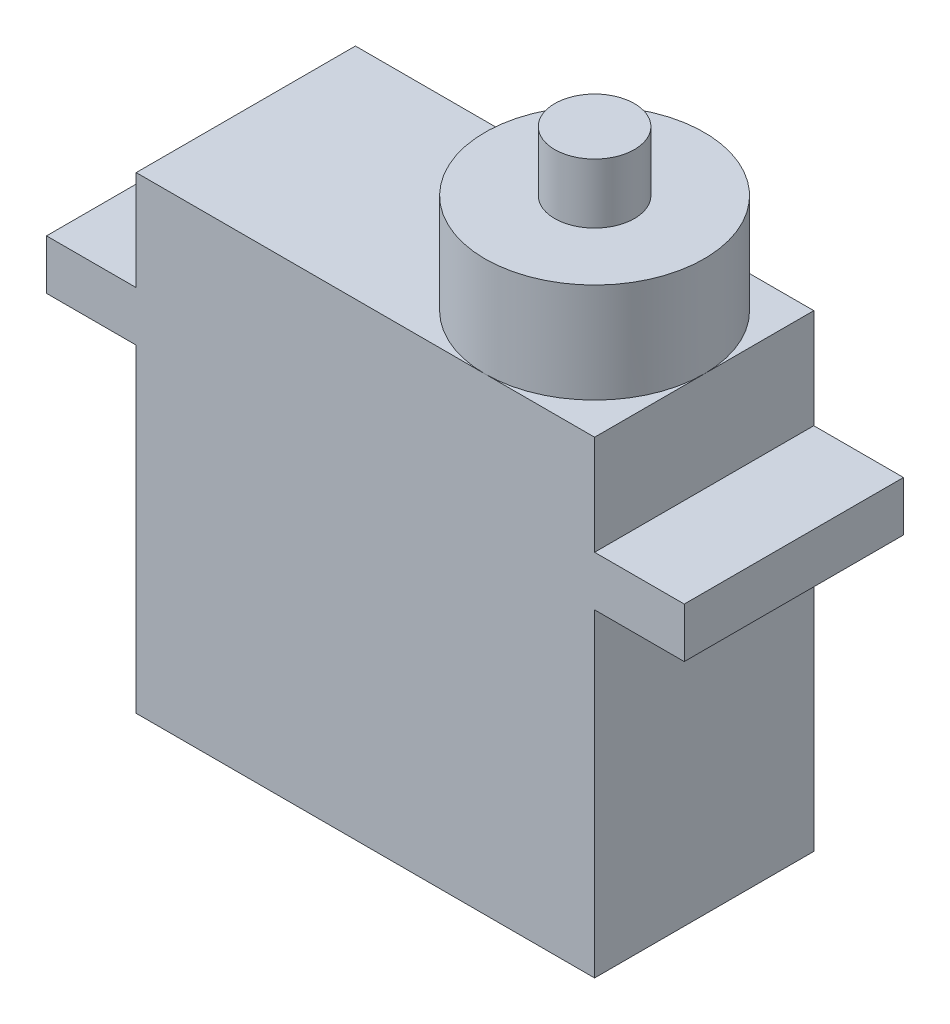
ISO-10303-21;
HEADER;
FILE_DESCRIPTION(('STEP AP214'),'2;1');
FILE_NAME('part.step','',(''),(''),'','','');
FILE_SCHEMA(('AUTOMOTIVE_DESIGN { 1 0 10303 214 1 1 1 1 }'));
ENDSEC;
DATA;
#1=APPLICATION_CONTEXT('core data for automotive mechanical design processes');
#2=APPLICATION_PROTOCOL_DEFINITION('international standard','automotive_design',2000,#1);
#3=PRODUCT_CONTEXT('',#1,'mechanical');
#4=PRODUCT('Part','Part','',(#3));
#5=PRODUCT_RELATED_PRODUCT_CATEGORY('part','',(#4));
#6=PRODUCT_DEFINITION_FORMATION('','',#4);
#7=PRODUCT_DEFINITION_CONTEXT('part definition',#1,'design');
#8=PRODUCT_DEFINITION('design','',#6,#7);
#9=PRODUCT_DEFINITION_SHAPE('','',#8);
#10=(LENGTH_UNIT() NAMED_UNIT(*) SI_UNIT(.MILLI.,.METRE.));
#11=(NAMED_UNIT(*) PLANE_ANGLE_UNIT() SI_UNIT($,.RADIAN.));
#12=(NAMED_UNIT(*) SI_UNIT($,.STERADIAN.) SOLID_ANGLE_UNIT());
#13=UNCERTAINTY_MEASURE_WITH_UNIT(LENGTH_MEASURE(1.E-05),#10,'distance_accuracy_value','');
#14=(GEOMETRIC_REPRESENTATION_CONTEXT(3) GLOBAL_UNCERTAINTY_ASSIGNED_CONTEXT((#13)) GLOBAL_UNIT_ASSIGNED_CONTEXT((#10,
#11,#12)) REPRESENTATION_CONTEXT('',''));
#15=CARTESIAN_POINT('',(0.,0.,0.));
#16=DIRECTION('',(0.,0.,1.));
#17=DIRECTION('',(1.,0.,0.));
#18=AXIS2_PLACEMENT_3D('',#15,#16,#17);
#19=CARTESIAN_POINT('',(0.,23.5,0.));
#20=DIRECTION('',(0.,1.,0.));
#21=DIRECTION('',(0.,0.,1.));
#22=AXIS2_PLACEMENT_3D('',#19,#20,#21);
#23=PLANE('',#22);
#24=CARTESIAN_POINT('',(6.,23.5,0.));
#25=DIRECTION('',(0.,1.,0.));
#26=DIRECTION('',(0.,0.,1.));
#27=AXIS2_PLACEMENT_3D('',#24,#25,#26);
#28=CIRCLE('',#27,5.5);
#29=CARTESIAN_POINT('',(6.,23.5,5.5));
#30=VERTEX_POINT('',#29);
#31=CARTESIAN_POINT('',(11.5,23.5,0.));
#32=VERTEX_POINT('',#31);
#33=EDGE_CURVE('E163',#30,#32,#28,.T.);
#34=ORIENTED_EDGE('',*,*,#33,.F.);
#35=DIRECTION('',(1.,0.,0.));
#36=VECTOR('',#35,1.);
#37=CARTESIAN_POINT('',(-11.5,23.5,5.5));
#38=LINE('',#37,#36);
#39=CARTESIAN_POINT('',(11.5,23.5,5.5));
#40=VERTEX_POINT('',#39);
#41=EDGE_CURVE('E152',#30,#40,#38,.T.);
#42=ORIENTED_EDGE('',*,*,#41,.T.);
#43=DIRECTION('',(0.,0.,-1.));
#44=VECTOR('',#43,1.);
#45=CARTESIAN_POINT('',(11.5,23.5,-5.5));
#46=LINE('',#45,#44);
#47=EDGE_CURVE('E164',#40,#32,#46,.T.);
#48=ORIENTED_EDGE('',*,*,#47,.T.);
#49=EDGE_LOOP('',(#34,#42,#48));
#50=FACE_BOUND('',#49,.T.);
#51=ADVANCED_FACE('F45',(#50),#23,.T.);
#52=CARTESIAN_POINT('',(6.,23.5,-5.5));
#53=VERTEX_POINT('',#52);
#54=EDGE_CURVE('E54',#32,#53,#28,.T.);
#55=ORIENTED_EDGE('',*,*,#54,.F.);
#56=CARTESIAN_POINT('',(11.5,23.5,-5.5));
#57=VERTEX_POINT('',#56);
#58=EDGE_CURVE('E176',#32,#57,#46,.T.);
#59=ORIENTED_EDGE('',*,*,#58,.T.);
#60=DIRECTION('',(-1.,0.,0.));
#61=VECTOR('',#60,1.);
#62=CARTESIAN_POINT('',(-11.5,23.5,-5.5));
#63=LINE('',#62,#61);
#64=EDGE_CURVE('E177',#57,#53,#63,.T.);
#65=ORIENTED_EDGE('',*,*,#64,.T.);
#66=EDGE_LOOP('',(#55,#59,#65));
#67=FACE_BOUND('',#66,.T.);
#68=ADVANCED_FACE('F279',(#67),#23,.T.);
#69=CARTESIAN_POINT('',(0.,18.5,0.));
#70=DIRECTION('',(0.,1.,0.));
#71=DIRECTION('',(0.,0.,1.));
#72=AXIS2_PLACEMENT_3D('',#69,#70,#71);
#73=PLANE('',#72);
#74=DIRECTION('',(0.,0.,-1.));
#75=VECTOR('',#74,1.);
#76=CARTESIAN_POINT('',(11.5,18.5,-5.5));
#77=LINE('',#76,#75);
#78=CARTESIAN_POINT('',(11.5,18.5,5.5));
#79=VERTEX_POINT('',#78);
#80=CARTESIAN_POINT('',(11.5,18.5,-5.5));
#81=VERTEX_POINT('',#80);
#82=EDGE_CURVE('E180',#79,#81,#77,.T.);
#83=ORIENTED_EDGE('',*,*,#82,.F.);
#84=DIRECTION('',(1.,0.,0.));
#85=VECTOR('',#84,1.);
#86=CARTESIAN_POINT('',(-16.,18.5,5.5));
#87=LINE('',#86,#85);
#88=CARTESIAN_POINT('',(16.,18.5,5.5));
#89=VERTEX_POINT('',#88);
#90=EDGE_CURVE('E205',#79,#89,#87,.T.);
#91=ORIENTED_EDGE('',*,*,#90,.T.);
#92=DIRECTION('',(0.,0.,-1.));
#93=VECTOR('',#92,1.);
#94=CARTESIAN_POINT('',(16.,18.5,-5.5));
#95=LINE('',#94,#93);
#96=CARTESIAN_POINT('',(16.,18.5,-5.5));
#97=VERTEX_POINT('',#96);
#98=EDGE_CURVE('E196',#89,#97,#95,.T.);
#99=ORIENTED_EDGE('',*,*,#98,.T.);
#100=DIRECTION('',(-1.,0.,0.));
#101=VECTOR('',#100,1.);
#102=CARTESIAN_POINT('',(-16.,18.5,-5.5));
#103=LINE('',#102,#101);
#104=EDGE_CURVE('E201',#97,#81,#103,.T.);
#105=ORIENTED_EDGE('',*,*,#104,.T.);
#106=EDGE_LOOP('',(#83,#91,#99,#105));
#107=FACE_BOUND('',#106,.T.);
#108=ADVANCED_FACE('F274',(#107),#73,.T.);
#109=CARTESIAN_POINT('',(11.5,16.,-5.5));
#110=DIRECTION('',(-1.,0.,0.));
#111=DIRECTION('',(0.,0.,1.));
#112=AXIS2_PLACEMENT_3D('',#109,#110,#111);
#113=PLANE('',#112);
#114=DIRECTION('',(0.,0.,-1.));
#115=VECTOR('',#114,1.);
#116=CARTESIAN_POINT('',(11.5,0.,-5.5));
#117=LINE('',#116,#115);
#118=CARTESIAN_POINT('',(11.5,0.,5.5));
#119=VERTEX_POINT('',#118);
#120=CARTESIAN_POINT('',(11.5,0.,-5.5));
#121=VERTEX_POINT('',#120);
#122=EDGE_CURVE('E231',#119,#121,#117,.T.);
#123=ORIENTED_EDGE('',*,*,#122,.T.);
#124=DIRECTION('',(0.,-1.,0.));
#125=VECTOR('',#124,1.);
#126=CARTESIAN_POINT('',(11.5,16.,-5.5));
#127=LINE('',#126,#125);
#128=CARTESIAN_POINT('',(11.5,16.,-5.5));
#129=VERTEX_POINT('',#128);
#130=EDGE_CURVE('E49',#129,#121,#127,.T.);
#131=ORIENTED_EDGE('',*,*,#130,.F.);
#132=DIRECTION('',(0.,0.,-1.));
#133=VECTOR('',#132,1.);
#134=CARTESIAN_POINT('',(11.5,16.,-5.5));
#135=LINE('',#134,#133);
#136=CARTESIAN_POINT('',(11.5,16.,5.5));
#137=VERTEX_POINT('',#136);
#138=EDGE_CURVE('E232',#137,#129,#135,.T.);
#139=ORIENTED_EDGE('',*,*,#138,.F.);
#140=DIRECTION('',(0.,-1.,0.));
#141=VECTOR('',#140,1.);
#142=CARTESIAN_POINT('',(11.5,16.,5.5));
#143=LINE('',#142,#141);
#144=EDGE_CURVE('E239',#137,#119,#143,.T.);
#145=ORIENTED_EDGE('',*,*,#144,.T.);
#146=EDGE_LOOP('',(#123,#131,#139,#145));
#147=FACE_BOUND('',#146,.T.);
#148=ADVANCED_FACE('F47',(#147),#113,.F.);
#149=CARTESIAN_POINT('',(-11.5,16.,-5.5));
#150=DIRECTION('',(0.,0.,1.));
#151=DIRECTION('',(1.,0.,0.));
#152=AXIS2_PLACEMENT_3D('',#149,#150,#151);
#153=PLANE('',#152);
#154=DIRECTION('',(-1.,0.,0.));
#155=VECTOR('',#154,1.);
#156=CARTESIAN_POINT('',(-11.5,0.,-5.5));
#157=LINE('',#156,#155);
#158=CARTESIAN_POINT('',(-11.5,0.,-5.5));
#159=VERTEX_POINT('',#158);
#160=EDGE_CURVE('E242',#121,#159,#157,.T.);
#161=ORIENTED_EDGE('',*,*,#160,.T.);
#162=DIRECTION('',(0.,-1.,0.));
#163=VECTOR('',#162,1.);
#164=CARTESIAN_POINT('',(-11.5,16.,-5.5));
#165=LINE('',#164,#163);
#166=CARTESIAN_POINT('',(-11.5,16.,-5.5));
#167=VERTEX_POINT('',#166);
#168=EDGE_CURVE('E171',#167,#159,#165,.T.);
#169=ORIENTED_EDGE('',*,*,#168,.F.);
#170=DIRECTION('',(-1.,0.,0.));
#171=VECTOR('',#170,1.);
#172=CARTESIAN_POINT('',(-16.,16.,-5.5));
#173=LINE('',#172,#171);
#174=CARTESIAN_POINT('',(-16.,16.,-5.5));
#175=VERTEX_POINT('',#174);
#176=EDGE_CURVE('E211',#167,#175,#173,.T.);
#177=ORIENTED_EDGE('',*,*,#176,.T.);
#178=DIRECTION('',(0.,-1.,0.));
#179=VECTOR('',#178,1.);
#180=CARTESIAN_POINT('',(-16.,18.5,-5.5));
#181=LINE('',#180,#179);
#182=CARTESIAN_POINT('',(-16.,18.5,-5.5));
#183=VERTEX_POINT('',#182);
#184=EDGE_CURVE('E225',#183,#175,#181,.T.);
#185=ORIENTED_EDGE('',*,*,#184,.F.);
#186=CARTESIAN_POINT('',(-11.5,18.5,-5.5));
#187=VERTEX_POINT('',#186);
#188=EDGE_CURVE('E199',#187,#183,#103,.T.);
#189=ORIENTED_EDGE('',*,*,#188,.F.);
#190=DIRECTION('',(0.,-1.,0.));
#191=VECTOR('',#190,1.);
#192=CARTESIAN_POINT('',(-11.5,23.5,-5.5));
#193=LINE('',#192,#191);
#194=CARTESIAN_POINT('',(-11.5,23.5,-5.5));
#195=VERTEX_POINT('',#194);
#196=EDGE_CURVE('E189',#195,#187,#193,.T.);
#197=ORIENTED_EDGE('',*,*,#196,.F.);
#198=EDGE_CURVE('E175',#53,#195,#63,.T.);
#199=ORIENTED_EDGE('',*,*,#198,.F.);
#200=ORIENTED_EDGE('',*,*,#64,.F.);
#201=DIRECTION('',(0.,-1.,0.));
#202=VECTOR('',#201,1.);
#203=CARTESIAN_POINT('',(11.5,23.5,-5.5));
#204=LINE('',#203,#202);
#205=EDGE_CURVE('E192',#57,#81,#204,.T.);
#206=ORIENTED_EDGE('',*,*,#205,.T.);
#207=ORIENTED_EDGE('',*,*,#104,.F.);
#208=DIRECTION('',(0.,-1.,0.));
#209=VECTOR('',#208,1.);
#210=CARTESIAN_POINT('',(16.,18.5,-5.5));
#211=LINE('',#210,#209);
#212=CARTESIAN_POINT('',(16.,16.,-5.5));
#213=VERTEX_POINT('',#212);
#214=EDGE_CURVE('E228',#97,#213,#211,.T.);
#215=ORIENTED_EDGE('',*,*,#214,.T.);
#216=EDGE_CURVE('E212',#213,#129,#173,.T.);
#217=ORIENTED_EDGE('',*,*,#216,.T.);
#218=ORIENTED_EDGE('',*,*,#130,.T.);
#219=EDGE_LOOP('',(#161,#169,#177,#185,#189,#197,#199,#200,#206,#207,#215,#217,#218));
#220=FACE_BOUND('',#219,.T.);
#221=ADVANCED_FACE('F280',(#220),#153,.F.);
#222=CARTESIAN_POINT('',(-11.5,16.,-5.5));
#223=DIRECTION('',(1.,0.,0.));
#224=DIRECTION('',(0.,0.,-1.));
#225=AXIS2_PLACEMENT_3D('',#222,#223,#224);
#226=PLANE('',#225);
#227=DIRECTION('',(0.,0.,1.));
#228=VECTOR('',#227,1.);
#229=CARTESIAN_POINT('',(-11.5,0.,-5.5));
#230=LINE('',#229,#228);
#231=CARTESIAN_POINT('',(-11.5,0.,5.5));
#232=VERTEX_POINT('',#231);
#233=EDGE_CURVE('E244',#159,#232,#230,.T.);
#234=ORIENTED_EDGE('',*,*,#233,.T.);
#235=DIRECTION('',(0.,-1.,0.));
#236=VECTOR('',#235,1.);
#237=CARTESIAN_POINT('',(-11.5,16.,5.5));
#238=LINE('',#237,#236);
#239=CARTESIAN_POINT('',(-11.5,16.,5.5));
#240=VERTEX_POINT('',#239);
#241=EDGE_CURVE('E249',#240,#232,#238,.T.);
#242=ORIENTED_EDGE('',*,*,#241,.F.);
#243=DIRECTION('',(0.,0.,1.));
#244=VECTOR('',#243,1.);
#245=CARTESIAN_POINT('',(-11.5,16.,-5.5));
#246=LINE('',#245,#244);
#247=EDGE_CURVE('E235',#167,#240,#246,.T.);
#248=ORIENTED_EDGE('',*,*,#247,.F.);
#249=ORIENTED_EDGE('',*,*,#168,.T.);
#250=EDGE_LOOP('',(#234,#242,#248,#249));
#251=FACE_BOUND('',#250,.T.);
#252=ADVANCED_FACE('F255',(#251),#226,.F.);
#253=CARTESIAN_POINT('',(-11.5,16.,5.5));
#254=DIRECTION('',(0.,0.,-1.));
#255=DIRECTION('',(-1.,0.,0.));
#256=AXIS2_PLACEMENT_3D('',#253,#254,#255);
#257=PLANE('',#256);
#258=DIRECTION('',(1.,0.,0.));
#259=VECTOR('',#258,1.);
#260=CARTESIAN_POINT('',(-11.5,0.,5.5));
#261=LINE('',#260,#259);
#262=EDGE_CURVE('E236',#232,#119,#261,.T.);
#263=ORIENTED_EDGE('',*,*,#262,.T.);
#264=ORIENTED_EDGE('',*,*,#144,.F.);
#265=DIRECTION('',(1.,0.,0.));
#266=VECTOR('',#265,1.);
#267=CARTESIAN_POINT('',(-16.,16.,5.5));
#268=LINE('',#267,#266);
#269=CARTESIAN_POINT('',(16.,16.,5.5));
#270=VERTEX_POINT('',#269);
#271=EDGE_CURVE('E217',#137,#270,#268,.T.);
#272=ORIENTED_EDGE('',*,*,#271,.T.);
#273=DIRECTION('',(0.,-1.,0.));
#274=VECTOR('',#273,1.);
#275=CARTESIAN_POINT('',(16.,18.5,5.5));
#276=LINE('',#275,#274);
#277=EDGE_CURVE('E208',#89,#270,#276,.T.);
#278=ORIENTED_EDGE('',*,*,#277,.F.);
#279=ORIENTED_EDGE('',*,*,#90,.F.);
#280=DIRECTION('',(0.,-1.,0.));
#281=VECTOR('',#280,1.);
#282=CARTESIAN_POINT('',(11.5,23.5,5.5));
#283=LINE('',#282,#281);
#284=EDGE_CURVE('E151',#40,#79,#283,.T.);
#285=ORIENTED_EDGE('',*,*,#284,.F.);
#286=ORIENTED_EDGE('',*,*,#41,.F.);
#287=CARTESIAN_POINT('',(-11.5,23.5,5.5));
#288=VERTEX_POINT('',#287);
#289=EDGE_CURVE('E143',#288,#30,#38,.T.);
#290=ORIENTED_EDGE('',*,*,#289,.F.);
#291=DIRECTION('',(0.,-1.,0.));
#292=VECTOR('',#291,1.);
#293=CARTESIAN_POINT('',(-11.5,23.5,5.5));
#294=LINE('',#293,#292);
#295=CARTESIAN_POINT('',(-11.5,18.5,5.5));
#296=VERTEX_POINT('',#295);
#297=EDGE_CURVE('E187',#288,#296,#294,.T.);
#298=ORIENTED_EDGE('',*,*,#297,.T.);
#299=CARTESIAN_POINT('',(-16.,18.5,5.5));
#300=VERTEX_POINT('',#299);
#301=EDGE_CURVE('E206',#300,#296,#87,.T.);
#302=ORIENTED_EDGE('',*,*,#301,.F.);
#303=DIRECTION('',(0.,-1.,0.));
#304=VECTOR('',#303,1.);
#305=CARTESIAN_POINT('',(-16.,18.5,5.5));
#306=LINE('',#305,#304);
#307=CARTESIAN_POINT('',(-16.,16.,5.5));
#308=VERTEX_POINT('',#307);
#309=EDGE_CURVE('E222',#300,#308,#306,.T.);
#310=ORIENTED_EDGE('',*,*,#309,.T.);
#311=EDGE_CURVE('E200',#308,#240,#268,.T.);
#312=ORIENTED_EDGE('',*,*,#311,.T.);
#313=ORIENTED_EDGE('',*,*,#241,.T.);
#314=EDGE_LOOP('',(#263,#264,#272,#278,#279,#285,#286,#290,#298,#302,#310,#312,#313));
#315=FACE_BOUND('',#314,.T.);
#316=ADVANCED_FACE('F156',(#315),#257,.F.);
#317=CARTESIAN_POINT('',(0.,0.,0.));
#318=DIRECTION('',(0.,1.,0.));
#319=DIRECTION('',(0.,0.,1.));
#320=AXIS2_PLACEMENT_3D('',#317,#318,#319);
#321=PLANE('',#320);
#322=ORIENTED_EDGE('',*,*,#122,.F.);
#323=ORIENTED_EDGE('',*,*,#262,.F.);
#324=ORIENTED_EDGE('',*,*,#233,.F.);
#325=ORIENTED_EDGE('',*,*,#160,.F.);
#326=EDGE_LOOP('',(#322,#323,#324,#325));
#327=FACE_BOUND('',#326,.T.);
#328=ADVANCED_FACE('F261',(#327),#321,.F.);
#329=CARTESIAN_POINT('',(0.,16.,0.));
#330=DIRECTION('',(0.,1.,0.));
#331=DIRECTION('',(0.,0.,1.));
#332=AXIS2_PLACEMENT_3D('',#329,#330,#331);
#333=PLANE('',#332);
#334=ORIENTED_EDGE('',*,*,#271,.F.);
#335=ORIENTED_EDGE('',*,*,#138,.T.);
#336=ORIENTED_EDGE('',*,*,#216,.F.);
#337=DIRECTION('',(0.,0.,-1.));
#338=VECTOR('',#337,1.);
#339=CARTESIAN_POINT('',(16.,16.,-5.5));
#340=LINE('',#339,#338);
#341=EDGE_CURVE('E195',#270,#213,#340,.T.);
#342=ORIENTED_EDGE('',*,*,#341,.F.);
#343=EDGE_LOOP('',(#334,#335,#336,#342));
#344=FACE_BOUND('',#343,.T.);
#345=ADVANCED_FACE('F267',(#344),#333,.F.);
#346=ORIENTED_EDGE('',*,*,#176,.F.);
#347=ORIENTED_EDGE('',*,*,#247,.T.);
#348=ORIENTED_EDGE('',*,*,#311,.F.);
#349=DIRECTION('',(0.,0.,1.));
#350=VECTOR('',#349,1.);
#351=CARTESIAN_POINT('',(-16.,16.,-5.5));
#352=LINE('',#351,#350);
#353=EDGE_CURVE('E215',#175,#308,#352,.T.);
#354=ORIENTED_EDGE('',*,*,#353,.F.);
#355=EDGE_LOOP('',(#346,#347,#348,#354));
#356=FACE_BOUND('',#355,.T.);
#357=ADVANCED_FACE('F296',(#356),#333,.F.);
#358=CARTESIAN_POINT('',(16.,18.5,-5.5));
#359=DIRECTION('',(-1.,0.,0.));
#360=DIRECTION('',(0.,0.,1.));
#361=AXIS2_PLACEMENT_3D('',#358,#359,#360);
#362=PLANE('',#361);
#363=ORIENTED_EDGE('',*,*,#341,.T.);
#364=ORIENTED_EDGE('',*,*,#214,.F.);
#365=ORIENTED_EDGE('',*,*,#98,.F.);
#366=ORIENTED_EDGE('',*,*,#277,.T.);
#367=EDGE_LOOP('',(#363,#364,#365,#366));
#368=FACE_BOUND('',#367,.T.);
#369=ADVANCED_FACE('F271',(#368),#362,.F.);
#370=CARTESIAN_POINT('',(-16.,18.5,-5.5));
#371=DIRECTION('',(1.,0.,0.));
#372=DIRECTION('',(0.,0.,-1.));
#373=AXIS2_PLACEMENT_3D('',#370,#371,#372);
#374=PLANE('',#373);
#375=ORIENTED_EDGE('',*,*,#353,.T.);
#376=ORIENTED_EDGE('',*,*,#309,.F.);
#377=DIRECTION('',(0.,0.,1.));
#378=VECTOR('',#377,1.);
#379=CARTESIAN_POINT('',(-16.,18.5,-5.5));
#380=LINE('',#379,#378);
#381=EDGE_CURVE('E203',#183,#300,#380,.T.);
#382=ORIENTED_EDGE('',*,*,#381,.F.);
#383=ORIENTED_EDGE('',*,*,#184,.T.);
#384=EDGE_LOOP('',(#375,#376,#382,#383));
#385=FACE_BOUND('',#384,.T.);
#386=ADVANCED_FACE('F293',(#385),#374,.F.);
#387=DIRECTION('',(0.,0.,1.));
#388=VECTOR('',#387,1.);
#389=CARTESIAN_POINT('',(-11.5,18.5,-5.5));
#390=LINE('',#389,#388);
#391=EDGE_CURVE('E183',#187,#296,#390,.T.);
#392=ORIENTED_EDGE('',*,*,#391,.F.);
#393=ORIENTED_EDGE('',*,*,#188,.T.);
#394=ORIENTED_EDGE('',*,*,#381,.T.);
#395=ORIENTED_EDGE('',*,*,#301,.T.);
#396=EDGE_LOOP('',(#392,#393,#394,#395));
#397=FACE_BOUND('',#396,.T.);
#398=ADVANCED_FACE('F290',(#397),#73,.T.);
#399=CARTESIAN_POINT('',(11.5,23.5,-5.5));
#400=DIRECTION('',(-1.,0.,0.));
#401=DIRECTION('',(0.,0.,1.));
#402=AXIS2_PLACEMENT_3D('',#399,#400,#401);
#403=PLANE('',#402);
#404=ORIENTED_EDGE('',*,*,#82,.T.);
#405=ORIENTED_EDGE('',*,*,#205,.F.);
#406=ORIENTED_EDGE('',*,*,#58,.F.);
#407=ORIENTED_EDGE('',*,*,#47,.F.);
#408=ORIENTED_EDGE('',*,*,#284,.T.);
#409=EDGE_LOOP('',(#404,#405,#406,#407,#408));
#410=FACE_BOUND('',#409,.T.);
#411=ADVANCED_FACE('F276',(#410),#403,.F.);
#412=CARTESIAN_POINT('',(-11.5,23.5,-5.5));
#413=DIRECTION('',(1.,0.,0.));
#414=DIRECTION('',(0.,0.,-1.));
#415=AXIS2_PLACEMENT_3D('',#412,#413,#414);
#416=PLANE('',#415);
#417=ORIENTED_EDGE('',*,*,#391,.T.);
#418=ORIENTED_EDGE('',*,*,#297,.F.);
#419=DIRECTION('',(0.,0.,1.));
#420=VECTOR('',#419,1.);
#421=CARTESIAN_POINT('',(-11.5,23.5,-5.5));
#422=LINE('',#421,#420);
#423=EDGE_CURVE('E147',#195,#288,#422,.T.);
#424=ORIENTED_EDGE('',*,*,#423,.F.);
#425=ORIENTED_EDGE('',*,*,#196,.T.);
#426=EDGE_LOOP('',(#417,#418,#424,#425));
#427=FACE_BOUND('',#426,.T.);
#428=ADVANCED_FACE('F285',(#427),#416,.F.);
#429=EDGE_CURVE('E62',#53,#30,#28,.T.);
#430=ORIENTED_EDGE('',*,*,#429,.F.);
#431=ORIENTED_EDGE('',*,*,#198,.T.);
#432=ORIENTED_EDGE('',*,*,#423,.T.);
#433=ORIENTED_EDGE('',*,*,#289,.T.);
#434=EDGE_LOOP('',(#430,#431,#432,#433));
#435=FACE_BOUND('',#434,.T.);
#436=ADVANCED_FACE('F145',(#435),#23,.T.);
#437=CARTESIAN_POINT('',(6.,28.5,0.));
#438=DIRECTION('',(0.,-1.,0.));
#439=DIRECTION('',(0.,0.,-1.));
#440=AXIS2_PLACEMENT_3D('',#437,#438,#439);
#441=CYLINDRICAL_SURFACE('',#440,5.5);
#442=CARTESIAN_POINT('',(6.,28.5,0.));
#443=DIRECTION('',(0.,1.,0.));
#444=DIRECTION('',(0.,0.,1.));
#445=AXIS2_PLACEMENT_3D('',#442,#443,#444);
#446=CIRCLE('',#445,5.5);
#447=CARTESIAN_POINT('',(6.,28.5,5.5));
#448=VERTEX_POINT('',#447);
#449=EDGE_CURVE('E166',#448,#448,#446,.T.);
#450=ORIENTED_EDGE('',*,*,#449,.F.);
#451=EDGE_LOOP('',(#450));
#452=FACE_BOUND('',#451,.T.);
#453=ORIENTED_EDGE('',*,*,#33,.T.);
#454=ORIENTED_EDGE('',*,*,#54,.T.);
#455=ORIENTED_EDGE('',*,*,#429,.T.);
#456=EDGE_LOOP('',(#453,#454,#455));
#457=FACE_BOUND('',#456,.T.);
#458=ADVANCED_FACE('F169',(#452,#457),#441,.T.);
#459=CARTESIAN_POINT('',(0.,28.5,0.));
#460=DIRECTION('',(0.,1.,0.));
#461=DIRECTION('',(0.,0.,1.));
#462=AXIS2_PLACEMENT_3D('',#459,#460,#461);
#463=PLANE('',#462);
#464=CARTESIAN_POINT('',(6.,28.5,0.));
#465=DIRECTION('',(0.,1.,0.));
#466=DIRECTION('',(0.,0.,1.));
#467=AXIS2_PLACEMENT_3D('',#464,#465,#466);
#468=CIRCLE('',#467,2.);
#469=CARTESIAN_POINT('',(6.,28.5,2.));
#470=VERTEX_POINT('',#469);
#471=EDGE_CURVE('E11',#470,#470,#468,.T.);
#472=ORIENTED_EDGE('',*,*,#471,.F.);
#473=EDGE_LOOP('',(#472));
#474=FACE_BOUND('',#473,.T.);
#475=ORIENTED_EDGE('',*,*,#449,.T.);
#476=EDGE_LOOP('',(#475));
#477=FACE_BOUND('',#476,.T.);
#478=ADVANCED_FACE('F318',(#474,#477),#463,.T.);
#479=CARTESIAN_POINT('',(6.,31.5,0.));
#480=DIRECTION('',(0.,-1.,0.));
#481=DIRECTION('',(0.,0.,-1.));
#482=AXIS2_PLACEMENT_3D('',#479,#480,#481);
#483=CYLINDRICAL_SURFACE('',#482,2.);
#484=CARTESIAN_POINT('',(6.,31.5,0.));
#485=DIRECTION('',(0.,1.,0.));
#486=DIRECTION('',(0.,0.,1.));
#487=AXIS2_PLACEMENT_3D('',#484,#485,#486);
#488=CIRCLE('',#487,2.);
#489=CARTESIAN_POINT('',(6.,31.5,2.));
#490=VERTEX_POINT('',#489);
#491=EDGE_CURVE('E167',#490,#490,#488,.T.);
#492=ORIENTED_EDGE('',*,*,#491,.F.);
#493=EDGE_LOOP('',(#492));
#494=FACE_BOUND('',#493,.T.);
#495=ORIENTED_EDGE('',*,*,#471,.T.);
#496=EDGE_LOOP('',(#495));
#497=FACE_BOUND('',#496,.T.);
#498=ADVANCED_FACE('F404',(#494,#497),#483,.T.);
#499=CARTESIAN_POINT('',(0.,31.5,0.));
#500=DIRECTION('',(0.,1.,0.));
#501=DIRECTION('',(0.,0.,1.));
#502=AXIS2_PLACEMENT_3D('',#499,#500,#501);
#503=PLANE('',#502);
#504=ORIENTED_EDGE('',*,*,#491,.T.);
#505=EDGE_LOOP('',(#504));
#506=FACE_BOUND('',#505,.T.);
#507=ADVANCED_FACE('F414',(#506),#503,.T.);
#508=CLOSED_SHELL('',(#51,#68,#108,#148,#221,#252,#316,#328,#345,#357,#369,#386,#398,#411,#428,
#436,#458,#478,#498,#507));
#509=MANIFOLD_SOLID_BREP('B2',#508);
#510=ADVANCED_BREP_SHAPE_REPRESENTATION('',(#18,#509),#14);
#511=SHAPE_DEFINITION_REPRESENTATION(#9,#510);
ENDSEC;
END-ISO-10303-21;
